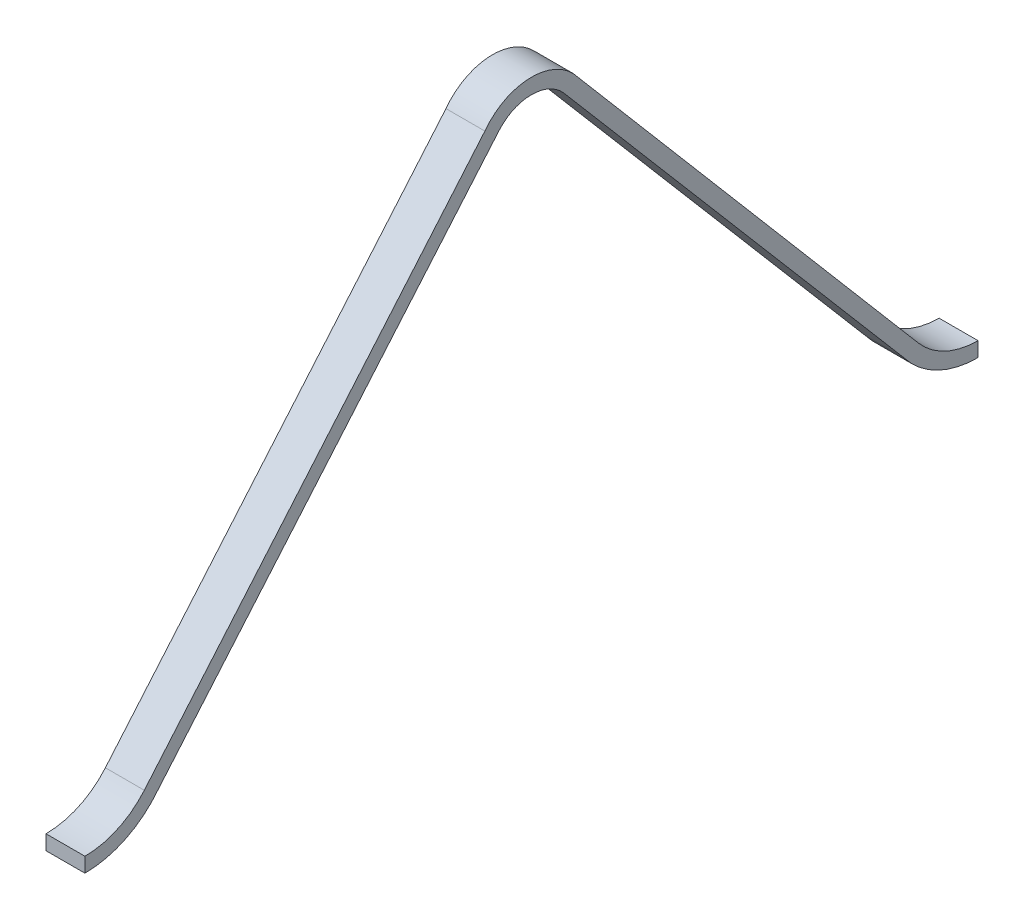
ISO-10303-21;
HEADER;
FILE_DESCRIPTION(('STEP AP214'),'2;1');
FILE_NAME('part.step','',(''),(''),'','','');
FILE_SCHEMA(('AUTOMOTIVE_DESIGN { 1 0 10303 214 1 1 1 1 }'));
ENDSEC;
DATA;
#1=APPLICATION_CONTEXT('core data for automotive mechanical design processes');
#2=APPLICATION_PROTOCOL_DEFINITION('international standard','automotive_design',2000,#1);
#3=PRODUCT_CONTEXT('',#1,'mechanical');
#4=PRODUCT('Part','Part','',(#3));
#5=PRODUCT_RELATED_PRODUCT_CATEGORY('part','',(#4));
#6=PRODUCT_DEFINITION_FORMATION('','',#4);
#7=PRODUCT_DEFINITION_CONTEXT('part definition',#1,'design');
#8=PRODUCT_DEFINITION('design','',#6,#7);
#9=PRODUCT_DEFINITION_SHAPE('','',#8);
#10=(LENGTH_UNIT() NAMED_UNIT(*) SI_UNIT(.MILLI.,.METRE.));
#11=(NAMED_UNIT(*) PLANE_ANGLE_UNIT() SI_UNIT($,.RADIAN.));
#12=(NAMED_UNIT(*) SI_UNIT($,.STERADIAN.) SOLID_ANGLE_UNIT());
#13=UNCERTAINTY_MEASURE_WITH_UNIT(LENGTH_MEASURE(1.E-05),#10,'distance_accuracy_value','');
#14=(GEOMETRIC_REPRESENTATION_CONTEXT(3) GLOBAL_UNCERTAINTY_ASSIGNED_CONTEXT((#13)) GLOBAL_UNIT_ASSIGNED_CONTEXT((#10,
#11,#12)) REPRESENTATION_CONTEXT('',''));
#15=CARTESIAN_POINT('',(0.,0.,0.));
#16=DIRECTION('',(0.,0.,1.));
#17=DIRECTION('',(1.,0.,0.));
#18=AXIS2_PLACEMENT_3D('',#15,#16,#17);
#19=CARTESIAN_POINT('',(0.,-40.5205258896049,57.3462021021014));
#20=DIRECTION('',(1.,0.,0.));
#21=DIRECTION('',(0.,0.,-1.));
#22=AXIS2_PLACEMENT_3D('',#19,#20,#21);
#23=CYLINDRICAL_SURFACE('',#22,10.0081650492269);
#24=DIRECTION('',(1.,0.,0.));
#25=VECTOR('',#24,1.);
#26=CARTESIAN_POINT('',(0.,-47.0032612357406,49.7214063615894));
#27=LINE('',#26,#25);
#28=CARTESIAN_POINT('',(0.,-47.0032612357406,49.7214063615894));
#29=VERTEX_POINT('',#28);
#30=CARTESIAN_POINT('',(5.,-47.0032612357406,49.7214063615894));
#31=VERTEX_POINT('',#30);
#32=EDGE_CURVE('E102',#29,#31,#27,.T.);
#33=ORIENTED_EDGE('',*,*,#32,.F.);
#34=CARTESIAN_POINT('',(0.,-40.5205258896049,57.3462021021014));
#35=DIRECTION('',(1.,0.,0.));
#36=DIRECTION('',(0.,0.,-1.));
#37=AXIS2_PLACEMENT_3D('',#34,#35,#36);
#38=CIRCLE('',#37,10.0081650492269);
#39=CARTESIAN_POINT('',(0.,-50.5286908180341,57.3477570709717));
#40=VERTEX_POINT('',#39);
#41=EDGE_CURVE('E112',#29,#40,#38,.F.);
#42=ORIENTED_EDGE('',*,*,#41,.T.);
#43=DIRECTION('',(1.,0.,0.));
#44=VECTOR('',#43,1.);
#45=CARTESIAN_POINT('',(0.,-50.5286908180341,57.3477570709717));
#46=LINE('',#45,#44);
#47=CARTESIAN_POINT('',(5.,-50.5286908180341,57.3477570709717));
#48=VERTEX_POINT('',#47);
#49=EDGE_CURVE('E107',#48,#40,#46,.F.);
#50=ORIENTED_EDGE('',*,*,#49,.F.);
#51=CARTESIAN_POINT('',(5.,-40.5205258896049,57.3462021021014));
#52=DIRECTION('',(1.,0.,0.));
#53=DIRECTION('',(0.,0.,-1.));
#54=AXIS2_PLACEMENT_3D('',#51,#52,#53);
#55=CIRCLE('',#54,10.0081650492269);
#56=EDGE_CURVE('E20',#31,#48,#55,.F.);
#57=ORIENTED_EDGE('',*,*,#56,.F.);
#58=EDGE_LOOP('',(#33,#42,#50,#57));
#59=FACE_BOUND('',#58,.T.);
#60=ADVANCED_FACE('F17',(#59),#23,.F.);
#61=CARTESIAN_POINT('',(0.,-51.4733546395943,57.3477570709717));
#62=DIRECTION('',(0.,0.,1.));
#63=DIRECTION('',(1.,0.,0.));
#64=AXIS2_PLACEMENT_3D('',#61,#62,#63);
#65=PLANE('',#64);
#66=DIRECTION('',(0.,1.,0.));
#67=VECTOR('',#66,1.);
#68=CARTESIAN_POINT('',(0.,-23.4217167742074,57.3477570709717));
#69=LINE('',#68,#67);
#70=CARTESIAN_POINT('',(0.,-52.4180184611546,57.3477570709705));
#71=VERTEX_POINT('',#70);
#72=EDGE_CURVE('E172',#40,#71,#69,.F.);
#73=ORIENTED_EDGE('',*,*,#72,.T.);
#74=DIRECTION('',(1.,0.,0.));
#75=VECTOR('',#74,1.);
#76=CARTESIAN_POINT('',(0.,-52.4180184611546,57.3477570709694));
#77=LINE('',#76,#75);
#78=CARTESIAN_POINT('',(5.,-52.4180184611546,57.3477570709705));
#79=VERTEX_POINT('',#78);
#80=EDGE_CURVE('E115',#79,#71,#77,.F.);
#81=ORIENTED_EDGE('',*,*,#80,.F.);
#82=DIRECTION('',(0.,1.,0.));
#83=VECTOR('',#82,1.);
#84=CARTESIAN_POINT('',(5.,-23.4217167742074,57.3477570709717));
#85=LINE('',#84,#83);
#86=EDGE_CURVE('E118',#48,#79,#85,.F.);
#87=ORIENTED_EDGE('',*,*,#86,.F.);
#88=ORIENTED_EDGE('',*,*,#49,.T.);
#89=EDGE_LOOP('',(#73,#81,#87,#88));
#90=FACE_BOUND('',#89,.T.);
#91=ADVANCED_FACE('F119',(#90),#65,.T.);
#92=CARTESIAN_POINT('',(0.,-40.5216246224569,57.3477570709694));
#93=DIRECTION('',(1.,0.,0.));
#94=DIRECTION('',(0.,0.,-1.));
#95=AXIS2_PLACEMENT_3D('',#92,#93,#94);
#96=CYLINDRICAL_SURFACE('',#95,11.8963938386977);
#97=CARTESIAN_POINT('',(0.,-40.5216246224569,57.3477570709694));
#98=DIRECTION('',(1.,0.,0.));
#99=DIRECTION('',(0.,0.,-1.));
#100=AXIS2_PLACEMENT_3D('',#97,#98,#99);
#101=CIRCLE('',#100,11.8963938386977);
#102=CARTESIAN_POINT('',(0.,-47.7961962394003,47.9347451111679));
#103=VERTEX_POINT('',#102);
#104=EDGE_CURVE('E170',#71,#103,#101,.T.);
#105=ORIENTED_EDGE('',*,*,#104,.T.);
#106=DIRECTION('',(1.,0.,0.));
#107=VECTOR('',#106,1.);
#108=CARTESIAN_POINT('',(0.,-47.7961962394003,47.9347451111679));
#109=LINE('',#108,#107);
#110=CARTESIAN_POINT('',(5.,-47.7961962394003,47.9347451111679));
#111=VERTEX_POINT('',#110);
#112=EDGE_CURVE('E153',#111,#103,#109,.F.);
#113=ORIENTED_EDGE('',*,*,#112,.F.);
#114=CARTESIAN_POINT('',(5.,-40.5216246224569,57.3477570709694));
#115=DIRECTION('',(1.,0.,0.));
#116=DIRECTION('',(0.,0.,-1.));
#117=AXIS2_PLACEMENT_3D('',#114,#115,#116);
#118=CIRCLE('',#117,11.8963938386977);
#119=EDGE_CURVE('E124',#79,#111,#118,.T.);
#120=ORIENTED_EDGE('',*,*,#119,.F.);
#121=ORIENTED_EDGE('',*,*,#80,.T.);
#122=EDGE_LOOP('',(#105,#113,#120,#121));
#123=FACE_BOUND('',#122,.T.);
#124=ADVANCED_FACE('F221',(#123),#96,.T.);
#125=CARTESIAN_POINT('',(0.,-22.1091463490171,26.0559489995213));
#126=DIRECTION('',(0.,-0.648418968997062,-0.761283679481432));
#127=DIRECTION('',(0.,0.761283679481432,-0.648418968997062));
#128=AXIS2_PLACEMENT_3D('',#125,#126,#127);
#129=PLANE('',#128);
#130=DIRECTION('',(0.,0.761283679481432,-0.648418968997062));
#131=VECTOR('',#130,1.);
#132=CARTESIAN_POINT('',(0.,-47.7961962394003,47.9347451111679));
#133=LINE('',#132,#131);
#134=CARTESIAN_POINT('',(0.,3.57790354136587,4.17715288787492));
#135=VERTEX_POINT('',#134);
#136=EDGE_CURVE('E169',#103,#135,#133,.T.);
#137=ORIENTED_EDGE('',*,*,#136,.T.);
#138=DIRECTION('',(1.,0.,0.));
#139=VECTOR('',#138,1.);
#140=CARTESIAN_POINT('',(0.,3.57790354136608,4.17715288787474));
#141=LINE('',#140,#139);
#142=CARTESIAN_POINT('',(5.,3.57790354136587,4.17715288787492));
#143=VERTEX_POINT('',#142);
#144=EDGE_CURVE('E151',#135,#143,#141,.T.);
#145=ORIENTED_EDGE('',*,*,#144,.T.);
#146=DIRECTION('',(0.,0.761283679481432,-0.648418968997062));
#147=VECTOR('',#146,1.);
#148=CARTESIAN_POINT('',(5.,-47.7961962394003,47.9347451111679));
#149=LINE('',#148,#147);
#150=EDGE_CURVE('E181',#111,#143,#149,.T.);
#151=ORIENTED_EDGE('',*,*,#150,.F.);
#152=ORIENTED_EDGE('',*,*,#112,.T.);
#153=EDGE_LOOP('',(#137,#145,#151,#152));
#154=FACE_BOUND('',#153,.T.);
#155=ADVANCED_FACE('F223',(#154),#129,.T.);
#156=CARTESIAN_POINT('',(0.,0.,0.));
#157=DIRECTION('',(1.,0.,0.));
#158=DIRECTION('',(0.,0.,-1.));
#159=AXIS2_PLACEMENT_3D('',#156,#157,#158);
#160=CYLINDRICAL_SURFACE('',#159,5.50000000000002);
#161=ORIENTED_EDGE('',*,*,#144,.F.);
#162=CARTESIAN_POINT('',(0.,0.,0.));
#163=DIRECTION('',(1.,0.,0.));
#164=DIRECTION('',(0.,0.,-1.));
#165=AXIS2_PLACEMENT_3D('',#162,#163,#164);
#166=CIRCLE('',#165,5.50000000000002);
#167=CARTESIAN_POINT('',(0.,3.57790354136718,-4.17715288787379));
#168=VERTEX_POINT('',#167);
#169=EDGE_CURVE('E167',#135,#168,#166,.F.);
#170=ORIENTED_EDGE('',*,*,#169,.T.);
#171=DIRECTION('',(1.,0.,0.));
#172=VECTOR('',#171,1.);
#173=CARTESIAN_POINT('',(0.,3.57790354136608,-4.17715288787472));
#174=LINE('',#173,#172);
#175=CARTESIAN_POINT('',(5.,3.57790354136718,-4.17715288787379));
#176=VERTEX_POINT('',#175);
#177=EDGE_CURVE('E148',#176,#168,#174,.F.);
#178=ORIENTED_EDGE('',*,*,#177,.F.);
#179=CARTESIAN_POINT('',(5.,0.,0.));
#180=DIRECTION('',(1.,0.,0.));
#181=DIRECTION('',(0.,0.,-1.));
#182=AXIS2_PLACEMENT_3D('',#179,#180,#181);
#183=CIRCLE('',#182,5.50000000000002);
#184=EDGE_CURVE('E179',#143,#176,#183,.F.);
#185=ORIENTED_EDGE('',*,*,#184,.F.);
#186=EDGE_LOOP('',(#161,#170,#178,#185));
#187=FACE_BOUND('',#186,.T.);
#188=ADVANCED_FACE('F228',(#187),#160,.F.);
#189=CARTESIAN_POINT('',(0.,-22.1091463490171,-26.0559489995213));
#190=DIRECTION('',(0.,-0.648418968997062,0.761283679481432));
#191=DIRECTION('',(0.,-0.761283679481432,-0.648418968997062));
#192=AXIS2_PLACEMENT_3D('',#189,#190,#191);
#193=PLANE('',#192);
#194=DIRECTION('',(0.,-0.761283679481432,-0.648418968997062));
#195=VECTOR('',#194,1.);
#196=CARTESIAN_POINT('',(0.,3.57790354136608,-4.17715288787473));
#197=LINE('',#196,#195);
#198=CARTESIAN_POINT('',(0.,-47.7961962394003,-47.9347451111679));
#199=VERTEX_POINT('',#198);
#200=EDGE_CURVE('E166',#168,#199,#197,.T.);
#201=ORIENTED_EDGE('',*,*,#200,.T.);
#202=DIRECTION('',(1.,0.,0.));
#203=VECTOR('',#202,1.);
#204=CARTESIAN_POINT('',(0.,-47.7961962394003,-47.9347451111679));
#205=LINE('',#204,#203);
#206=CARTESIAN_POINT('',(5.,-47.7961962394003,-47.9347451111679));
#207=VERTEX_POINT('',#206);
#208=EDGE_CURVE('E145',#207,#199,#205,.F.);
#209=ORIENTED_EDGE('',*,*,#208,.F.);
#210=DIRECTION('',(0.,-0.761283679481432,-0.648418968997062));
#211=VECTOR('',#210,1.);
#212=CARTESIAN_POINT('',(5.,3.57790354136608,-4.17715288787473));
#213=LINE('',#212,#211);
#214=EDGE_CURVE('E178',#176,#207,#213,.T.);
#215=ORIENTED_EDGE('',*,*,#214,.F.);
#216=ORIENTED_EDGE('',*,*,#177,.T.);
#217=EDGE_LOOP('',(#201,#209,#215,#216));
#218=FACE_BOUND('',#217,.T.);
#219=ADVANCED_FACE('F232',(#218),#193,.T.);
#220=CARTESIAN_POINT('',(0.,-40.5216246224569,-57.3477570709694));
#221=DIRECTION('',(1.,0.,0.));
#222=DIRECTION('',(0.,0.,-1.));
#223=AXIS2_PLACEMENT_3D('',#220,#221,#222);
#224=CYLINDRICAL_SURFACE('',#223,11.8963938386977);
#225=CARTESIAN_POINT('',(0.,-40.5216246224569,-57.3477570709694));
#226=DIRECTION('',(1.,0.,0.));
#227=DIRECTION('',(0.,0.,-1.));
#228=AXIS2_PLACEMENT_3D('',#225,#226,#227);
#229=CIRCLE('',#228,11.8963938386977);
#230=CARTESIAN_POINT('',(0.,-52.4180184611546,-57.3477570709717));
#231=VERTEX_POINT('',#230);
#232=EDGE_CURVE('E164',#199,#231,#229,.T.);
#233=ORIENTED_EDGE('',*,*,#232,.T.);
#234=DIRECTION('',(-1.,0.,0.));
#235=VECTOR('',#234,1.);
#236=CARTESIAN_POINT('',(0.,-52.4180184611546,-57.3477570709717));
#237=LINE('',#236,#235);
#238=CARTESIAN_POINT('',(5.,-52.4180184611546,-57.3477570709717));
#239=VERTEX_POINT('',#238);
#240=EDGE_CURVE('E131',#239,#231,#237,.T.);
#241=ORIENTED_EDGE('',*,*,#240,.F.);
#242=CARTESIAN_POINT('',(5.,-40.5216246224569,-57.3477570709694));
#243=DIRECTION('',(1.,0.,0.));
#244=DIRECTION('',(0.,0.,-1.));
#245=AXIS2_PLACEMENT_3D('',#242,#243,#244);
#246=CIRCLE('',#245,11.8963938386977);
#247=EDGE_CURVE('E176',#207,#239,#246,.T.);
#248=ORIENTED_EDGE('',*,*,#247,.F.);
#249=ORIENTED_EDGE('',*,*,#208,.T.);
#250=EDGE_LOOP('',(#233,#241,#248,#249));
#251=FACE_BOUND('',#250,.T.);
#252=ADVANCED_FACE('F235',(#251),#224,.T.);
#253=CARTESIAN_POINT('',(0.,-51.4733546395943,-57.3477570709717));
#254=DIRECTION('',(0.,0.,-1.));
#255=DIRECTION('',(-1.,0.,0.));
#256=AXIS2_PLACEMENT_3D('',#253,#254,#255);
#257=PLANE('',#256);
#258=DIRECTION('',(0.,1.,0.));
#259=VECTOR('',#258,1.);
#260=CARTESIAN_POINT('',(0.,-23.4217167742074,-57.3477570709717));
#261=LINE('',#260,#259);
#262=CARTESIAN_POINT('',(0.,-50.528690818034,-57.3477570709717));
#263=VERTEX_POINT('',#262);
#264=EDGE_CURVE('E163',#231,#263,#261,.T.);
#265=ORIENTED_EDGE('',*,*,#264,.T.);
#266=DIRECTION('',(1.,0.,0.));
#267=VECTOR('',#266,1.);
#268=CARTESIAN_POINT('',(0.,-50.528690818034,-57.3477570709718));
#269=LINE('',#268,#267);
#270=CARTESIAN_POINT('',(5.,-50.528690818034,-57.3477570709717));
#271=VERTEX_POINT('',#270);
#272=EDGE_CURVE('E139',#263,#271,#269,.T.);
#273=ORIENTED_EDGE('',*,*,#272,.T.);
#274=DIRECTION('',(0.,1.,0.));
#275=VECTOR('',#274,1.);
#276=CARTESIAN_POINT('',(5.,-23.4217167742074,-57.3477570709717));
#277=LINE('',#276,#275);
#278=EDGE_CURVE('E142',#239,#271,#277,.T.);
#279=ORIENTED_EDGE('',*,*,#278,.F.);
#280=ORIENTED_EDGE('',*,*,#240,.T.);
#281=EDGE_LOOP('',(#265,#273,#279,#280));
#282=FACE_BOUND('',#281,.T.);
#283=ADVANCED_FACE('F203',(#282),#257,.T.);
#284=CARTESIAN_POINT('',(0.,-21.2806176531576,27.8515627062544));
#285=DIRECTION('',(0.,0.647744647919898,0.761857513640922));
#286=DIRECTION('',(0.,-0.761857513640922,0.647744647919898));
#287=AXIS2_PLACEMENT_3D('',#284,#285,#286);
#288=PLANE('',#287);
#289=DIRECTION('',(0.,-0.761857513640922,0.647744647919898));
#290=VECTOR('',#289,1.);
#291=CARTESIAN_POINT('',(0.,4.44202592942538,5.98171905091933));
#292=LINE('',#291,#290);
#293=CARTESIAN_POINT('',(0.,4.44202592942539,5.98171905091932));
#294=VERTEX_POINT('',#293);
#295=EDGE_CURVE('E174',#294,#29,#292,.T.);
#296=ORIENTED_EDGE('',*,*,#295,.T.);
#297=ORIENTED_EDGE('',*,*,#32,.T.);
#298=DIRECTION('',(0.,-0.761857513640922,0.647744647919898));
#299=VECTOR('',#298,1.);
#300=CARTESIAN_POINT('',(5.,4.44202592942538,5.98171905091933));
#301=LINE('',#300,#299);
#302=CARTESIAN_POINT('',(5.,4.44202592942539,5.98171905091932));
#303=VERTEX_POINT('',#302);
#304=EDGE_CURVE('E129',#303,#31,#301,.T.);
#305=ORIENTED_EDGE('',*,*,#304,.F.);
#306=DIRECTION('',(1.,0.,0.));
#307=VECTOR('',#306,1.);
#308=CARTESIAN_POINT('',(0.,4.44202592942538,5.98171905091933));
#309=LINE('',#308,#307);
#310=EDGE_CURVE('E135',#294,#303,#309,.T.);
#311=ORIENTED_EDGE('',*,*,#310,.F.);
#312=EDGE_LOOP('',(#296,#297,#305,#311));
#313=FACE_BOUND('',#312,.T.);
#314=ADVANCED_FACE('F217',(#313),#288,.T.);
#315=CARTESIAN_POINT('',(5.,-23.4217167742074,-3.9190872769268E-13));
#316=DIRECTION('',(1.,0.,0.));
#317=DIRECTION('',(0.,0.,-1.));
#318=AXIS2_PLACEMENT_3D('',#315,#316,#317);
#319=PLANE('',#318);
#320=ORIENTED_EDGE('',*,*,#247,.T.);
#321=ORIENTED_EDGE('',*,*,#278,.T.);
#322=CARTESIAN_POINT('',(5.,-40.5205258896049,-57.3462021021014));
#323=DIRECTION('',(1.,0.,0.));
#324=DIRECTION('',(0.,0.,-1.));
#325=AXIS2_PLACEMENT_3D('',#322,#323,#324);
#326=CIRCLE('',#325,10.0081650492269);
#327=CARTESIAN_POINT('',(5.,-47.0032612357406,-49.7214063615894));
#328=VERTEX_POINT('',#327);
#329=EDGE_CURVE('E141',#271,#328,#326,.F.);
#330=ORIENTED_EDGE('',*,*,#329,.T.);
#331=DIRECTION('',(0.,0.761857513640922,0.647744647919898));
#332=VECTOR('',#331,1.);
#333=CARTESIAN_POINT('',(5.,-21.2806176531576,-27.8515627062544));
#334=LINE('',#333,#332);
#335=CARTESIAN_POINT('',(5.,4.44202592942561,-5.98171905091918));
#336=VERTEX_POINT('',#335);
#337=EDGE_CURVE('E138',#336,#328,#334,.F.);
#338=ORIENTED_EDGE('',*,*,#337,.F.);
#339=CARTESIAN_POINT('',(5.,0.,0.));
#340=DIRECTION('',(1.,0.,0.));
#341=DIRECTION('',(0.,0.,-1.));
#342=AXIS2_PLACEMENT_3D('',#339,#340,#341);
#343=CIRCLE('',#342,7.45067494672923);
#344=EDGE_CURVE('E158',#303,#336,#343,.F.);
#345=ORIENTED_EDGE('',*,*,#344,.F.);
#346=ORIENTED_EDGE('',*,*,#304,.T.);
#347=ORIENTED_EDGE('',*,*,#56,.T.);
#348=ORIENTED_EDGE('',*,*,#86,.T.);
#349=ORIENTED_EDGE('',*,*,#119,.T.);
#350=ORIENTED_EDGE('',*,*,#150,.T.);
#351=ORIENTED_EDGE('',*,*,#184,.T.);
#352=ORIENTED_EDGE('',*,*,#214,.T.);
#353=EDGE_LOOP('',(#320,#321,#330,#338,#345,#346,#347,#348,#349,#350,#351,#352));
#354=FACE_BOUND('',#353,.T.);
#355=ADVANCED_FACE('F127',(#354),#319,.T.);
#356=CARTESIAN_POINT('',(0.,-40.5205258896049,-57.3462021021014));
#357=DIRECTION('',(1.,0.,0.));
#358=DIRECTION('',(0.,0.,-1.));
#359=AXIS2_PLACEMENT_3D('',#356,#357,#358);
#360=CYLINDRICAL_SURFACE('',#359,10.0081650492269);
#361=ORIENTED_EDGE('',*,*,#272,.F.);
#362=CARTESIAN_POINT('',(0.,-40.5205258896049,-57.3462021021014));
#363=DIRECTION('',(1.,0.,0.));
#364=DIRECTION('',(0.,0.,-1.));
#365=AXIS2_PLACEMENT_3D('',#362,#363,#364);
#366=CIRCLE('',#365,10.0081650492269);
#367=CARTESIAN_POINT('',(0.,-47.0032612357406,-49.7214063615894));
#368=VERTEX_POINT('',#367);
#369=EDGE_CURVE('E161',#263,#368,#366,.F.);
#370=ORIENTED_EDGE('',*,*,#369,.T.);
#371=DIRECTION('',(1.,0.,0.));
#372=VECTOR('',#371,1.);
#373=CARTESIAN_POINT('',(0.,-47.0032612357406,-49.7214063615894));
#374=LINE('',#373,#372);
#375=EDGE_CURVE('E190',#328,#368,#374,.F.);
#376=ORIENTED_EDGE('',*,*,#375,.F.);
#377=ORIENTED_EDGE('',*,*,#329,.F.);
#378=EDGE_LOOP('',(#361,#370,#376,#377));
#379=FACE_BOUND('',#378,.T.);
#380=ADVANCED_FACE('F209',(#379),#360,.F.);
#381=CARTESIAN_POINT('',(0.,-23.4217167742074,-3.9190872769268E-13));
#382=DIRECTION('',(1.,0.,0.));
#383=DIRECTION('',(0.,0.,-1.));
#384=AXIS2_PLACEMENT_3D('',#381,#382,#383);
#385=PLANE('',#384);
#386=ORIENTED_EDGE('',*,*,#369,.F.);
#387=ORIENTED_EDGE('',*,*,#264,.F.);
#388=ORIENTED_EDGE('',*,*,#232,.F.);
#389=ORIENTED_EDGE('',*,*,#200,.F.);
#390=ORIENTED_EDGE('',*,*,#169,.F.);
#391=ORIENTED_EDGE('',*,*,#136,.F.);
#392=ORIENTED_EDGE('',*,*,#104,.F.);
#393=ORIENTED_EDGE('',*,*,#72,.F.);
#394=ORIENTED_EDGE('',*,*,#41,.F.);
#395=ORIENTED_EDGE('',*,*,#295,.F.);
#396=CARTESIAN_POINT('',(0.,0.,0.));
#397=DIRECTION('',(1.,0.,0.));
#398=DIRECTION('',(0.,0.,-1.));
#399=AXIS2_PLACEMENT_3D('',#396,#397,#398);
#400=CIRCLE('',#399,7.45067494672923);
#401=CARTESIAN_POINT('',(0.,4.44202592942561,-5.98171905091918));
#402=VERTEX_POINT('',#401);
#403=EDGE_CURVE('E35',#402,#294,#400,.T.);
#404=ORIENTED_EDGE('',*,*,#403,.F.);
#405=DIRECTION('',(0.,0.761857513640922,0.647744647919898));
#406=VECTOR('',#405,1.);
#407=CARTESIAN_POINT('',(0.,-21.2806176531576,-27.8515627062544));
#408=LINE('',#407,#406);
#409=EDGE_CURVE('E26',#368,#402,#408,.T.);
#410=ORIENTED_EDGE('',*,*,#409,.F.);
#411=EDGE_LOOP('',(#386,#387,#388,#389,#390,#391,#392,#393,#394,#395,#404,#410));
#412=FACE_BOUND('',#411,.T.);
#413=ADVANCED_FACE('F211',(#412),#385,.F.);
#414=CARTESIAN_POINT('',(0.,0.,0.));
#415=DIRECTION('',(1.,0.,0.));
#416=DIRECTION('',(0.,0.,-1.));
#417=AXIS2_PLACEMENT_3D('',#414,#415,#416);
#418=CYLINDRICAL_SURFACE('',#417,7.45067494672923);
#419=ORIENTED_EDGE('',*,*,#403,.T.);
#420=ORIENTED_EDGE('',*,*,#310,.T.);
#421=ORIENTED_EDGE('',*,*,#344,.T.);
#422=DIRECTION('',(1.,0.,0.));
#423=VECTOR('',#422,1.);
#424=CARTESIAN_POINT('',(0.,4.44202592942541,-5.98171905091935));
#425=LINE('',#424,#423);
#426=EDGE_CURVE('E11',#402,#336,#425,.T.);
#427=ORIENTED_EDGE('',*,*,#426,.F.);
#428=EDGE_LOOP('',(#419,#420,#421,#427));
#429=FACE_BOUND('',#428,.T.);
#430=ADVANCED_FACE('F215',(#429),#418,.T.);
#431=CARTESIAN_POINT('',(0.,-21.2806176531576,-27.8515627062544));
#432=DIRECTION('',(0.,0.647744647919898,-0.761857513640922));
#433=DIRECTION('',(0.,0.761857513640922,0.647744647919898));
#434=AXIS2_PLACEMENT_3D('',#431,#432,#433);
#435=PLANE('',#434);
#436=ORIENTED_EDGE('',*,*,#409,.T.);
#437=ORIENTED_EDGE('',*,*,#426,.T.);
#438=ORIENTED_EDGE('',*,*,#337,.T.);
#439=ORIENTED_EDGE('',*,*,#375,.T.);
#440=EDGE_LOOP('',(#436,#437,#438,#439));
#441=FACE_BOUND('',#440,.T.);
#442=ADVANCED_FACE('F213',(#441),#435,.T.);
#443=CLOSED_SHELL('',(#60,#91,#124,#155,#188,#219,#252,#283,#314,#355,#380,#413,#430,#442));
#444=MANIFOLD_SOLID_BREP('B1',#443);
#445=ADVANCED_BREP_SHAPE_REPRESENTATION('',(#18,#444),#14);
#446=SHAPE_DEFINITION_REPRESENTATION(#9,#445);
ENDSEC;
END-ISO-10303-21;
